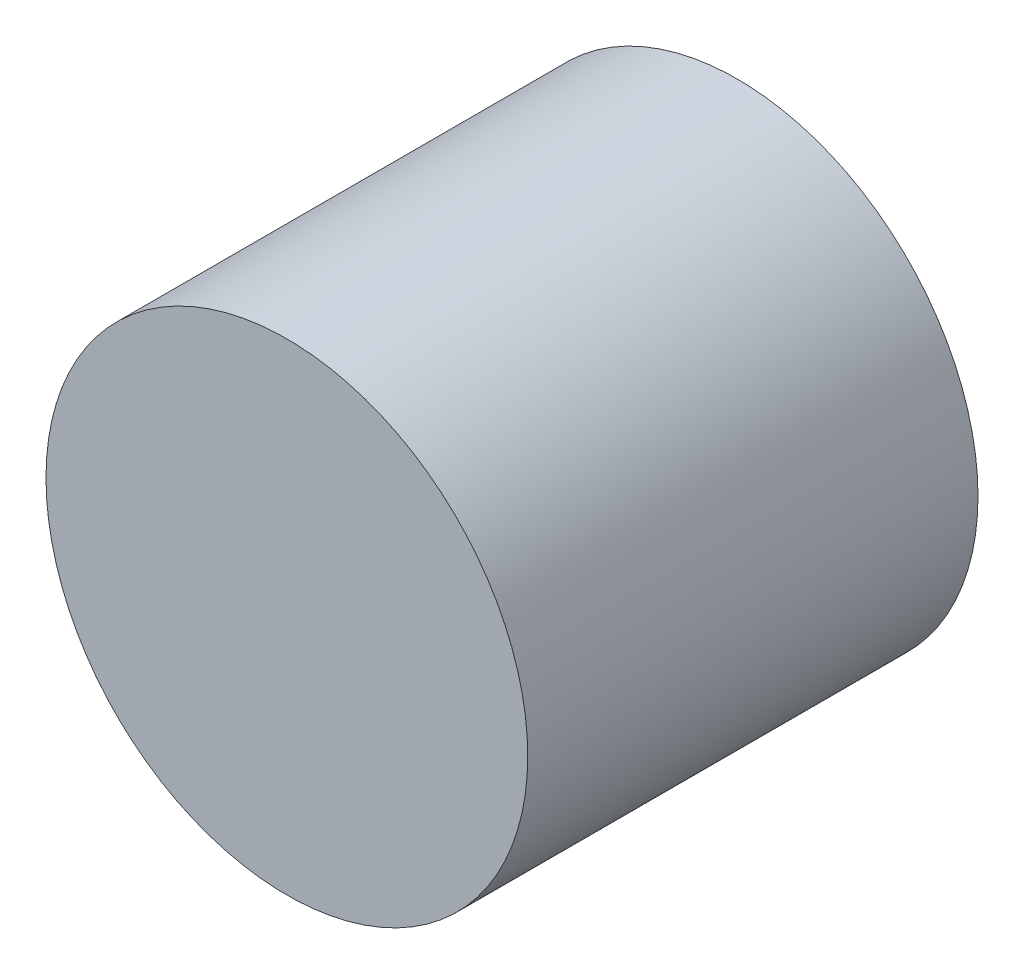
ISO-10303-21;
HEADER;
FILE_DESCRIPTION(('STEP AP214'),'2;1');
FILE_NAME('part.step','',(''),(''),'','','');
FILE_SCHEMA(('AUTOMOTIVE_DESIGN { 1 0 10303 214 1 1 1 1 }'));
ENDSEC;
DATA;
#1=APPLICATION_CONTEXT('core data for automotive mechanical design processes');
#2=APPLICATION_PROTOCOL_DEFINITION('international standard','automotive_design',2000,#1);
#3=PRODUCT_CONTEXT('',#1,'mechanical');
#4=PRODUCT('Part','Part','',(#3));
#5=PRODUCT_RELATED_PRODUCT_CATEGORY('part','',(#4));
#6=PRODUCT_DEFINITION_FORMATION('','',#4);
#7=PRODUCT_DEFINITION_CONTEXT('part definition',#1,'design');
#8=PRODUCT_DEFINITION('design','',#6,#7);
#9=PRODUCT_DEFINITION_SHAPE('','',#8);
#10=(LENGTH_UNIT() NAMED_UNIT(*) SI_UNIT(.MILLI.,.METRE.));
#11=(NAMED_UNIT(*) PLANE_ANGLE_UNIT() SI_UNIT($,.RADIAN.));
#12=(NAMED_UNIT(*) SI_UNIT($,.STERADIAN.) SOLID_ANGLE_UNIT());
#13=UNCERTAINTY_MEASURE_WITH_UNIT(LENGTH_MEASURE(1.E-05),#10,'distance_accuracy_value','');
#14=(GEOMETRIC_REPRESENTATION_CONTEXT(3) GLOBAL_UNCERTAINTY_ASSIGNED_CONTEXT((#13)) GLOBAL_UNIT_ASSIGNED_CONTEXT((#10,
#11,#12)) REPRESENTATION_CONTEXT('',''));
#15=CARTESIAN_POINT('',(0.,0.,0.));
#16=DIRECTION('',(0.,0.,1.));
#17=DIRECTION('',(1.,0.,0.));
#18=AXIS2_PLACEMENT_3D('',#15,#16,#17);
#19=CARTESIAN_POINT('',(0.,0.,177.8));
#20=DIRECTION('',(0.,0.,-1.));
#21=DIRECTION('',(-1.,0.,0.));
#22=AXIS2_PLACEMENT_3D('',#19,#20,#21);
#23=CYLINDRICAL_SURFACE('',#22,95.123);
#24=CARTESIAN_POINT('',(0.,0.,177.8));
#25=DIRECTION('',(0.,0.,1.));
#26=DIRECTION('',(1.,0.,0.));
#27=AXIS2_PLACEMENT_3D('',#24,#25,#26);
#28=CIRCLE('',#27,95.123);
#29=CARTESIAN_POINT('',(95.123,0.,177.8));
#30=VERTEX_POINT('',#29);
#31=EDGE_CURVE('E10',#30,#30,#28,.T.);
#32=ORIENTED_EDGE('',*,*,#31,.F.);
#33=EDGE_LOOP('',(#32));
#34=FACE_BOUND('',#33,.T.);
#35=CARTESIAN_POINT('',(0.,0.,0.));
#36=DIRECTION('',(0.,0.,1.));
#37=DIRECTION('',(1.,0.,0.));
#38=AXIS2_PLACEMENT_3D('',#35,#36,#37);
#39=CIRCLE('',#38,95.123);
#40=CARTESIAN_POINT('',(95.123,0.,0.));
#41=VERTEX_POINT('',#40);
#42=EDGE_CURVE('E36',#41,#41,#39,.T.);
#43=ORIENTED_EDGE('',*,*,#42,.T.);
#44=EDGE_LOOP('',(#43));
#45=FACE_BOUND('',#44,.T.);
#46=ADVANCED_FACE('F33',(#34,#45),#23,.T.);
#47=CARTESIAN_POINT('',(0.,0.,177.8));
#48=DIRECTION('',(0.,0.,1.));
#49=DIRECTION('',(1.,0.,0.));
#50=AXIS2_PLACEMENT_3D('',#47,#48,#49);
#51=PLANE('',#50);
#52=ORIENTED_EDGE('',*,*,#31,.T.);
#53=EDGE_LOOP('',(#52));
#54=FACE_BOUND('',#53,.T.);
#55=ADVANCED_FACE('F48',(#54),#51,.T.);
#56=CARTESIAN_POINT('',(0.,0.,0.));
#57=DIRECTION('',(0.,0.,1.));
#58=DIRECTION('',(1.,0.,0.));
#59=AXIS2_PLACEMENT_3D('',#56,#57,#58);
#60=PLANE('',#59);
#61=ORIENTED_EDGE('',*,*,#42,.F.);
#62=EDGE_LOOP('',(#61));
#63=FACE_BOUND('',#62,.T.);
#64=ADVANCED_FACE('F46',(#63),#60,.F.);
#65=CLOSED_SHELL('',(#46,#55,#64));
#66=MANIFOLD_SOLID_BREP('B2',#65);
#67=ADVANCED_BREP_SHAPE_REPRESENTATION('',(#18,#66),#14);
#68=SHAPE_DEFINITION_REPRESENTATION(#9,#67);
ENDSEC;
END-ISO-10303-21;
